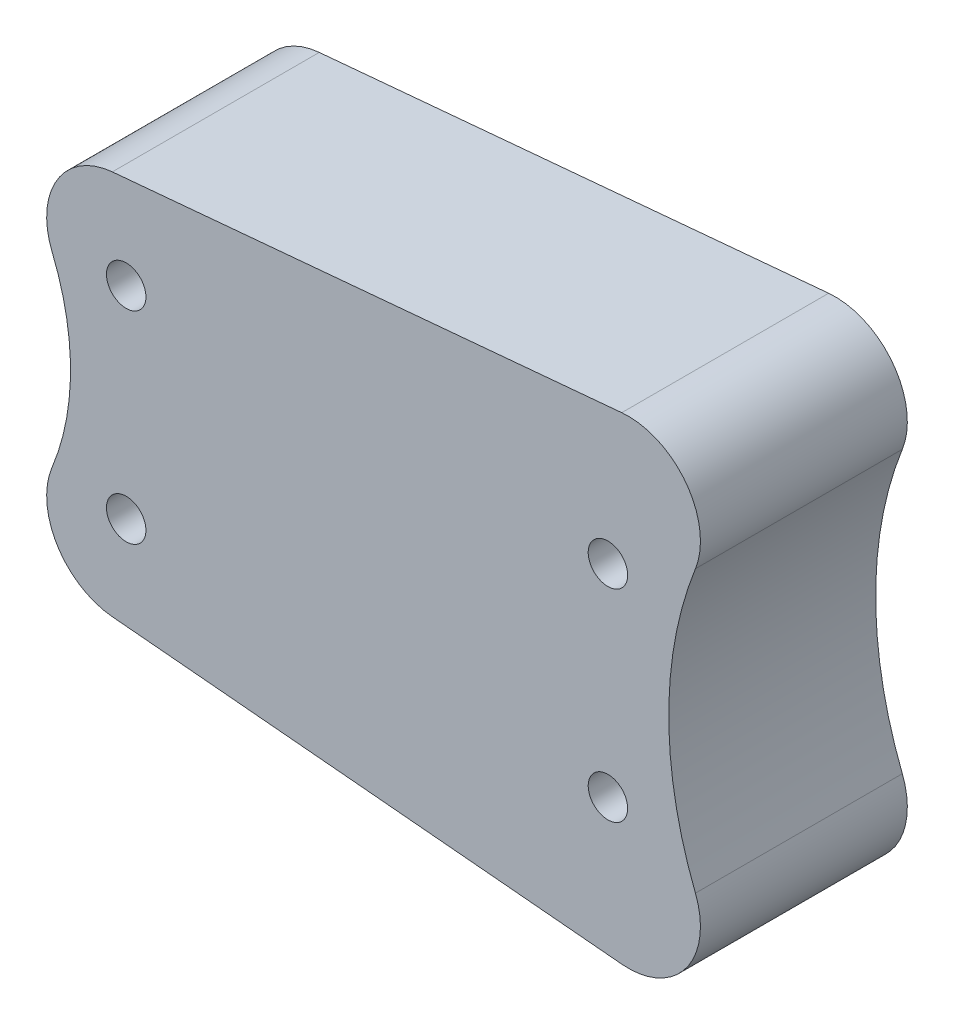
ISO-10303-21;
HEADER;
FILE_DESCRIPTION(('STEP AP214'),'2;1');
FILE_NAME('part.step','',(''),(''),'','','');
FILE_SCHEMA(('AUTOMOTIVE_DESIGN { 1 0 10303 214 1 1 1 1 }'));
ENDSEC;
DATA;
#1=APPLICATION_CONTEXT('core data for automotive mechanical design processes');
#2=APPLICATION_PROTOCOL_DEFINITION('international standard','automotive_design',2000,#1);
#3=PRODUCT_CONTEXT('',#1,'mechanical');
#4=PRODUCT('Part','Part','',(#3));
#5=PRODUCT_RELATED_PRODUCT_CATEGORY('part','',(#4));
#6=PRODUCT_DEFINITION_FORMATION('','',#4);
#7=PRODUCT_DEFINITION_CONTEXT('part definition',#1,'design');
#8=PRODUCT_DEFINITION('design','',#6,#7);
#9=PRODUCT_DEFINITION_SHAPE('','',#8);
#10=(LENGTH_UNIT() NAMED_UNIT(*) SI_UNIT(.MILLI.,.METRE.));
#11=(NAMED_UNIT(*) PLANE_ANGLE_UNIT() SI_UNIT($,.RADIAN.));
#12=(NAMED_UNIT(*) SI_UNIT($,.STERADIAN.) SOLID_ANGLE_UNIT());
#13=UNCERTAINTY_MEASURE_WITH_UNIT(LENGTH_MEASURE(1.E-05),#10,'distance_accuracy_value','');
#14=(GEOMETRIC_REPRESENTATION_CONTEXT(3) GLOBAL_UNCERTAINTY_ASSIGNED_CONTEXT((#13)) GLOBAL_UNIT_ASSIGNED_CONTEXT((#10,
#11,#12)) REPRESENTATION_CONTEXT('',''));
#15=CARTESIAN_POINT('',(0.,0.,0.));
#16=DIRECTION('',(0.,0.,1.));
#17=DIRECTION('',(1.,0.,0.));
#18=AXIS2_PLACEMENT_3D('',#15,#16,#17);
#19=CARTESIAN_POINT('',(-255.,0.,21.5));
#20=DIRECTION('',(0.,0.,1.));
#21=DIRECTION('',(1.,0.,0.));
#22=AXIS2_PLACEMENT_3D('',#19,#20,#21);
#23=PLANE('',#22);
#24=CARTESIAN_POINT('',(-92.3223164897252,-21.,21.5));
#25=DIRECTION('',(0.,0.,1.));
#26=DIRECTION('',(1.,0.,0.));
#27=AXIS2_PLACEMENT_3D('',#24,#25,#26);
#28=CIRCLE('',#27,4.1);
#29=CARTESIAN_POINT('',(-88.2223164897252,-21.,21.5));
#30=VERTEX_POINT('',#29);
#31=EDGE_CURVE('E190',#30,#30,#28,.T.);
#32=ORIENTED_EDGE('',*,*,#31,.F.);
#33=EDGE_LOOP('',(#32));
#34=FACE_BOUND('',#33,.T.);
#35=CARTESIAN_POINT('',(-192.444390405176,21.,21.5));
#36=DIRECTION('',(0.,0.,1.));
#37=DIRECTION('',(1.,0.,0.));
#38=AXIS2_PLACEMENT_3D('',#35,#36,#37);
#39=CIRCLE('',#38,4.09999999999999);
#40=CARTESIAN_POINT('',(-188.344390405176,21.,21.5));
#41=VERTEX_POINT('',#40);
#42=EDGE_CURVE('E133',#41,#41,#39,.T.);
#43=ORIENTED_EDGE('',*,*,#42,.F.);
#44=EDGE_LOOP('',(#43));
#45=FACE_BOUND('',#44,.T.);
#46=CARTESIAN_POINT('',(-255.,0.,21.5));
#47=DIRECTION('',(0.,0.,-1.));
#48=DIRECTION('',(1.,0.,0.));
#49=AXIS2_PLACEMENT_3D('',#46,#47,#48);
#50=CIRCLE('',#49,50.9863947475541);
#51=CARTESIAN_POINT('',(-207.84516111494,19.3915862960573,21.5));
#52=VERTEX_POINT('',#51);
#53=CARTESIAN_POINT('',(-207.84516111494,-19.3915862960573,21.5));
#54=VERTEX_POINT('',#53);
#55=EDGE_CURVE('E138',#52,#54,#50,.T.);
#56=ORIENTED_EDGE('',*,*,#55,.T.);
#57=CARTESIAN_POINT('',(-193.972390020258,-25.0965159323072,21.5));
#58=DIRECTION('',(0.,0.,1.));
#59=DIRECTION('',(1.,0.,0.));
#60=AXIS2_PLACEMENT_3D('',#57,#58,#59);
#61=CIRCLE('',#60,15.);
#62=CARTESIAN_POINT('',(-195.326131505696,-40.0353038346306,21.5));
#63=VERTEX_POINT('',#62);
#64=EDGE_CURVE('E152',#54,#63,#61,.T.);
#65=ORIENTED_EDGE('',*,*,#64,.T.);
#66=DIRECTION('',(0.995919193488227,-0.090249432362533,0.));
#67=VECTOR('',#66,1.);
#68=CARTESIAN_POINT('',(-220.71165321015,-37.7348873560312,21.5));
#69=LINE('',#68,#67);
#70=CARTESIAN_POINT('',(-89.449992689825,-49.6297182121682,21.5));
#71=VERTEX_POINT('',#70);
#72=EDGE_CURVE('E119',#63,#71,#69,.T.);
#73=ORIENTED_EDGE('',*,*,#72,.T.);
#74=CARTESIAN_POINT('',(-88.0962512043871,-34.6909303098448,21.5));
#75=DIRECTION('',(0.,0.,1.));
#76=DIRECTION('',(1.,0.,0.));
#77=AXIS2_PLACEMENT_3D('',#74,#75,#76);
#78=CIRCLE('',#77,15.);
#79=CARTESIAN_POINT('',(-74.1393877866708,-29.1949350824803,21.5));
#80=VERTEX_POINT('',#79);
#81=EDGE_CURVE('E148',#71,#80,#78,.T.);
#82=ORIENTED_EDGE('',*,*,#81,.T.);
#83=CARTESIAN_POINT('',(0.,0.,21.5));
#84=DIRECTION('',(0.,0.,-1.));
#85=DIRECTION('',(1.,0.,0.));
#86=AXIS2_PLACEMENT_3D('',#83,#84,#85);
#87=CIRCLE('',#86,79.6805688725463);
#88=CARTESIAN_POINT('',(-74.1393877866708,29.1949350824803,21.5));
#89=VERTEX_POINT('',#88);
#90=EDGE_CURVE('E161',#80,#89,#87,.T.);
#91=ORIENTED_EDGE('',*,*,#90,.T.);
#92=CARTESIAN_POINT('',(-88.0962512043871,34.6909303098448,21.5));
#93=DIRECTION('',(0.,0.,1.));
#94=DIRECTION('',(1.,0.,0.));
#95=AXIS2_PLACEMENT_3D('',#92,#93,#94);
#96=CIRCLE('',#95,15.);
#97=CARTESIAN_POINT('',(-89.449992689825,49.6297182121682,21.5));
#98=VERTEX_POINT('',#97);
#99=EDGE_CURVE('E54',#89,#98,#96,.T.);
#100=ORIENTED_EDGE('',*,*,#99,.T.);
#101=DIRECTION('',(-0.995919193488227,-0.090249432362533,0.));
#102=VECTOR('',#101,1.);
#103=CARTESIAN_POINT('',(-220.71165321015,37.7348873560312,21.5));
#104=LINE('',#103,#102);
#105=CARTESIAN_POINT('',(-195.326131505696,40.0353038346306,21.5));
#106=VERTEX_POINT('',#105);
#107=EDGE_CURVE('E139',#98,#106,#104,.T.);
#108=ORIENTED_EDGE('',*,*,#107,.T.);
#109=CARTESIAN_POINT('',(-193.972390020258,25.0965159323072,21.5));
#110=DIRECTION('',(0.,0.,1.));
#111=DIRECTION('',(1.,0.,0.));
#112=AXIS2_PLACEMENT_3D('',#109,#110,#111);
#113=CIRCLE('',#112,15.);
#114=EDGE_CURVE('E150',#106,#52,#113,.T.);
#115=ORIENTED_EDGE('',*,*,#114,.T.);
#116=EDGE_LOOP('',(#56,#65,#73,#82,#91,#100,#108,#115));
#117=FACE_BOUND('',#116,.T.);
#118=CARTESIAN_POINT('',(-192.444390405176,-21.,21.5));
#119=DIRECTION('',(0.,0.,1.));
#120=DIRECTION('',(1.,0.,0.));
#121=AXIS2_PLACEMENT_3D('',#118,#119,#120);
#122=CIRCLE('',#121,4.09999999999999);
#123=CARTESIAN_POINT('',(-188.344390405176,-21.,21.5));
#124=VERTEX_POINT('',#123);
#125=EDGE_CURVE('E184',#124,#124,#122,.T.);
#126=ORIENTED_EDGE('',*,*,#125,.F.);
#127=EDGE_LOOP('',(#126));
#128=FACE_BOUND('',#127,.T.);
#129=CARTESIAN_POINT('',(-92.3223164897252,21.,21.5));
#130=DIRECTION('',(0.,0.,1.));
#131=DIRECTION('',(1.,0.,0.));
#132=AXIS2_PLACEMENT_3D('',#129,#130,#131);
#133=CIRCLE('',#132,4.1);
#134=CARTESIAN_POINT('',(-88.2223164897252,21.,21.5));
#135=VERTEX_POINT('',#134);
#136=EDGE_CURVE('E196',#135,#135,#133,.T.);
#137=ORIENTED_EDGE('',*,*,#136,.F.);
#138=EDGE_LOOP('',(#137));
#139=FACE_BOUND('',#138,.T.);
#140=ADVANCED_FACE('F32',(#34,#45,#117,#128,#139),#23,.T.);
#141=CARTESIAN_POINT('',(-255.,0.,-21.5));
#142=DIRECTION('',(0.,0.,1.));
#143=DIRECTION('',(1.,0.,0.));
#144=AXIS2_PLACEMENT_3D('',#141,#142,#143);
#145=PLANE('',#144);
#146=DIRECTION('',(0.995919193488227,-0.090249432362533,0.));
#147=VECTOR('',#146,1.);
#148=CARTESIAN_POINT('',(-220.71165321015,-37.7348873560312,-21.5));
#149=LINE('',#148,#147);
#150=CARTESIAN_POINT('',(-195.326131505696,-40.0353038346306,-21.5));
#151=VERTEX_POINT('',#150);
#152=CARTESIAN_POINT('',(-89.449992689825,-49.6297182121682,-21.5));
#153=VERTEX_POINT('',#152);
#154=EDGE_CURVE('E116',#151,#153,#149,.T.);
#155=ORIENTED_EDGE('',*,*,#154,.F.);
#156=CARTESIAN_POINT('',(-193.972390020258,-25.0965159323072,-21.5));
#157=DIRECTION('',(0.,0.,1.));
#158=DIRECTION('',(1.,0.,0.));
#159=AXIS2_PLACEMENT_3D('',#156,#157,#158);
#160=CIRCLE('',#159,15.);
#161=CARTESIAN_POINT('',(-207.84516111494,-19.3915862960573,-21.5));
#162=VERTEX_POINT('',#161);
#163=EDGE_CURVE('E99',#151,#162,#160,.F.);
#164=ORIENTED_EDGE('',*,*,#163,.T.);
#165=CARTESIAN_POINT('',(-255.,0.,-21.5));
#166=DIRECTION('',(0.,0.,-1.));
#167=DIRECTION('',(1.,0.,0.));
#168=AXIS2_PLACEMENT_3D('',#165,#166,#167);
#169=CIRCLE('',#168,50.9863947475541);
#170=CARTESIAN_POINT('',(-207.84516111494,19.3915862960573,-21.5));
#171=VERTEX_POINT('',#170);
#172=EDGE_CURVE('E128',#171,#162,#169,.T.);
#173=ORIENTED_EDGE('',*,*,#172,.F.);
#174=CARTESIAN_POINT('',(-193.972390020258,25.0965159323072,-21.5));
#175=DIRECTION('',(0.,0.,1.));
#176=DIRECTION('',(1.,0.,0.));
#177=AXIS2_PLACEMENT_3D('',#174,#175,#176);
#178=CIRCLE('',#177,15.);
#179=CARTESIAN_POINT('',(-195.326131505696,40.0353038346306,-21.5));
#180=VERTEX_POINT('',#179);
#181=EDGE_CURVE('E110',#171,#180,#178,.F.);
#182=ORIENTED_EDGE('',*,*,#181,.T.);
#183=DIRECTION('',(-0.995919193488227,-0.090249432362533,0.));
#184=VECTOR('',#183,1.);
#185=CARTESIAN_POINT('',(-220.71165321015,37.7348873560312,-21.5));
#186=LINE('',#185,#184);
#187=CARTESIAN_POINT('',(-89.449992689825,49.6297182121682,-21.5));
#188=VERTEX_POINT('',#187);
#189=EDGE_CURVE('E131',#188,#180,#186,.T.);
#190=ORIENTED_EDGE('',*,*,#189,.F.);
#191=CARTESIAN_POINT('',(-88.0962512043871,34.6909303098448,-21.5));
#192=DIRECTION('',(0.,0.,1.));
#193=DIRECTION('',(1.,0.,0.));
#194=AXIS2_PLACEMENT_3D('',#191,#192,#193);
#195=CIRCLE('',#194,15.);
#196=CARTESIAN_POINT('',(-74.1393877866708,29.1949350824803,-21.5));
#197=VERTEX_POINT('',#196);
#198=EDGE_CURVE('E120',#188,#197,#195,.F.);
#199=ORIENTED_EDGE('',*,*,#198,.T.);
#200=CARTESIAN_POINT('',(0.,0.,-21.5));
#201=DIRECTION('',(0.,0.,-1.));
#202=DIRECTION('',(1.,0.,0.));
#203=AXIS2_PLACEMENT_3D('',#200,#201,#202);
#204=CIRCLE('',#203,79.6805688725463);
#205=CARTESIAN_POINT('',(-74.1393877866708,-29.1949350824803,-21.5));
#206=VERTEX_POINT('',#205);
#207=EDGE_CURVE('E127',#206,#197,#204,.T.);
#208=ORIENTED_EDGE('',*,*,#207,.F.);
#209=CARTESIAN_POINT('',(-88.0962512043871,-34.6909303098448,-21.5));
#210=DIRECTION('',(0.,0.,1.));
#211=DIRECTION('',(1.,0.,0.));
#212=AXIS2_PLACEMENT_3D('',#209,#210,#211);
#213=CIRCLE('',#212,15.);
#214=EDGE_CURVE('E126',#206,#153,#213,.F.);
#215=ORIENTED_EDGE('',*,*,#214,.T.);
#216=EDGE_LOOP('',(#155,#164,#173,#182,#190,#199,#208,#215));
#217=FACE_BOUND('',#216,.T.);
#218=CARTESIAN_POINT('',(-192.444390405176,21.,-21.5));
#219=DIRECTION('',(0.,0.,1.));
#220=DIRECTION('',(1.,0.,0.));
#221=AXIS2_PLACEMENT_3D('',#218,#219,#220);
#222=CIRCLE('',#221,4.09999999999999);
#223=CARTESIAN_POINT('',(-188.344390405176,21.,-21.5));
#224=VERTEX_POINT('',#223);
#225=EDGE_CURVE('E181',#224,#224,#222,.T.);
#226=ORIENTED_EDGE('',*,*,#225,.T.);
#227=EDGE_LOOP('',(#226));
#228=FACE_BOUND('',#227,.T.);
#229=CARTESIAN_POINT('',(-192.444390405176,-21.,-21.5));
#230=DIRECTION('',(0.,0.,1.));
#231=DIRECTION('',(1.,0.,0.));
#232=AXIS2_PLACEMENT_3D('',#229,#230,#231);
#233=CIRCLE('',#232,4.09999999999999);
#234=CARTESIAN_POINT('',(-188.344390405176,-21.,-21.5));
#235=VERTEX_POINT('',#234);
#236=EDGE_CURVE('E187',#235,#235,#233,.T.);
#237=ORIENTED_EDGE('',*,*,#236,.T.);
#238=EDGE_LOOP('',(#237));
#239=FACE_BOUND('',#238,.T.);
#240=CARTESIAN_POINT('',(-92.3223164897252,-21.,-21.5));
#241=DIRECTION('',(0.,0.,1.));
#242=DIRECTION('',(1.,0.,0.));
#243=AXIS2_PLACEMENT_3D('',#240,#241,#242);
#244=CIRCLE('',#243,4.1);
#245=CARTESIAN_POINT('',(-88.2223164897252,-21.,-21.5));
#246=VERTEX_POINT('',#245);
#247=EDGE_CURVE('E193',#246,#246,#244,.T.);
#248=ORIENTED_EDGE('',*,*,#247,.T.);
#249=EDGE_LOOP('',(#248));
#250=FACE_BOUND('',#249,.T.);
#251=CARTESIAN_POINT('',(-92.3223164897252,21.,-21.5));
#252=DIRECTION('',(0.,0.,1.));
#253=DIRECTION('',(1.,0.,0.));
#254=AXIS2_PLACEMENT_3D('',#251,#252,#253);
#255=CIRCLE('',#254,4.1);
#256=CARTESIAN_POINT('',(-88.2223164897252,21.,-21.5));
#257=VERTEX_POINT('',#256);
#258=EDGE_CURVE('E199',#257,#257,#255,.T.);
#259=ORIENTED_EDGE('',*,*,#258,.T.);
#260=EDGE_LOOP('',(#259));
#261=FACE_BOUND('',#260,.T.);
#262=ADVANCED_FACE('F123',(#217,#228,#239,#250,#261),#145,.F.);
#263=CARTESIAN_POINT('',(-255.,0.,21.5));
#264=DIRECTION('',(0.,0.,-1.));
#265=DIRECTION('',(-1.,0.,0.));
#266=AXIS2_PLACEMENT_3D('',#263,#264,#265);
#267=CYLINDRICAL_SURFACE('',#266,50.9863947475541);
#268=ORIENTED_EDGE('',*,*,#172,.T.);
#269=DIRECTION('',(0.,0.,-1.));
#270=VECTOR('',#269,1.);
#271=CARTESIAN_POINT('',(-207.84516111494,-19.3915862960573,21.5));
#272=LINE('',#271,#270);
#273=EDGE_CURVE('E104',#162,#54,#272,.F.);
#274=ORIENTED_EDGE('',*,*,#273,.T.);
#275=ORIENTED_EDGE('',*,*,#55,.F.);
#276=DIRECTION('',(0.,0.,-1.));
#277=VECTOR('',#276,1.);
#278=CARTESIAN_POINT('',(-207.84516111494,19.3915862960573,21.5));
#279=LINE('',#278,#277);
#280=EDGE_CURVE('E109',#52,#171,#279,.T.);
#281=ORIENTED_EDGE('',*,*,#280,.T.);
#282=EDGE_LOOP('',(#268,#274,#275,#281));
#283=FACE_BOUND('',#282,.T.);
#284=ADVANCED_FACE('F177',(#283),#267,.F.);
#285=CARTESIAN_POINT('',(-220.71165321015,-37.7348873560312,21.5));
#286=DIRECTION('',(0.090249432362533,0.995919193488227,0.));
#287=DIRECTION('',(-0.995919193488227,0.090249432362533,0.));
#288=AXIS2_PLACEMENT_3D('',#285,#286,#287);
#289=PLANE('',#288);
#290=ORIENTED_EDGE('',*,*,#72,.F.);
#291=DIRECTION('',(0.,0.,-1.));
#292=VECTOR('',#291,1.);
#293=CARTESIAN_POINT('',(-195.326131505696,-40.0353038346306,21.5));
#294=LINE('',#293,#292);
#295=EDGE_CURVE('E103',#63,#151,#294,.T.);
#296=ORIENTED_EDGE('',*,*,#295,.T.);
#297=ORIENTED_EDGE('',*,*,#154,.T.);
#298=DIRECTION('',(0.,0.,-1.));
#299=VECTOR('',#298,1.);
#300=CARTESIAN_POINT('',(-89.4499926898251,-49.6297182121682,21.5));
#301=LINE('',#300,#299);
#302=EDGE_CURVE('E121',#153,#71,#301,.F.);
#303=ORIENTED_EDGE('',*,*,#302,.T.);
#304=EDGE_LOOP('',(#290,#296,#297,#303));
#305=FACE_BOUND('',#304,.T.);
#306=ADVANCED_FACE('F115',(#305),#289,.F.);
#307=CARTESIAN_POINT('',(0.,0.,21.5));
#308=DIRECTION('',(0.,0.,-1.));
#309=DIRECTION('',(-1.,0.,0.));
#310=AXIS2_PLACEMENT_3D('',#307,#308,#309);
#311=CYLINDRICAL_SURFACE('',#310,79.6805688725463);
#312=ORIENTED_EDGE('',*,*,#90,.F.);
#313=DIRECTION('',(0.,0.,-1.));
#314=VECTOR('',#313,1.);
#315=CARTESIAN_POINT('',(-74.1393877866708,-29.1949350824803,21.5));
#316=LINE('',#315,#314);
#317=EDGE_CURVE('E11',#80,#206,#316,.T.);
#318=ORIENTED_EDGE('',*,*,#317,.T.);
#319=ORIENTED_EDGE('',*,*,#207,.T.);
#320=DIRECTION('',(0.,0.,-1.));
#321=VECTOR('',#320,1.);
#322=CARTESIAN_POINT('',(-74.1393877866708,29.1949350824803,21.5));
#323=LINE('',#322,#321);
#324=EDGE_CURVE('E40',#197,#89,#323,.F.);
#325=ORIENTED_EDGE('',*,*,#324,.T.);
#326=EDGE_LOOP('',(#312,#318,#319,#325));
#327=FACE_BOUND('',#326,.T.);
#328=ADVANCED_FACE('F160',(#327),#311,.F.);
#329=CARTESIAN_POINT('',(-220.71165321015,37.7348873560312,21.5));
#330=DIRECTION('',(0.090249432362533,-0.995919193488227,0.));
#331=DIRECTION('',(0.995919193488227,0.090249432362533,0.));
#332=AXIS2_PLACEMENT_3D('',#329,#330,#331);
#333=PLANE('',#332);
#334=ORIENTED_EDGE('',*,*,#189,.T.);
#335=DIRECTION('',(0.,0.,-1.));
#336=VECTOR('',#335,1.);
#337=CARTESIAN_POINT('',(-195.326131505696,40.0353038346306,21.5));
#338=LINE('',#337,#336);
#339=EDGE_CURVE('E47',#180,#106,#338,.F.);
#340=ORIENTED_EDGE('',*,*,#339,.T.);
#341=ORIENTED_EDGE('',*,*,#107,.F.);
#342=DIRECTION('',(0.,0.,-1.));
#343=VECTOR('',#342,1.);
#344=CARTESIAN_POINT('',(-89.4499926898251,49.6297182121682,21.5));
#345=LINE('',#344,#343);
#346=EDGE_CURVE('E154',#98,#188,#345,.T.);
#347=ORIENTED_EDGE('',*,*,#346,.T.);
#348=EDGE_LOOP('',(#334,#340,#341,#347));
#349=FACE_BOUND('',#348,.T.);
#350=ADVANCED_FACE('F170',(#349),#333,.F.);
#351=CARTESIAN_POINT('',(-192.444390405176,21.,21.5));
#352=DIRECTION('',(0.,0.,-1.));
#353=DIRECTION('',(-1.,0.,0.));
#354=AXIS2_PLACEMENT_3D('',#351,#352,#353);
#355=CYLINDRICAL_SURFACE('',#354,4.09999999999999);
#356=ORIENTED_EDGE('',*,*,#42,.T.);
#357=EDGE_LOOP('',(#356));
#358=FACE_BOUND('',#357,.T.);
#359=ORIENTED_EDGE('',*,*,#225,.F.);
#360=EDGE_LOOP('',(#359));
#361=FACE_BOUND('',#360,.T.);
#362=ADVANCED_FACE('F218',(#358,#361),#355,.F.);
#363=CARTESIAN_POINT('',(-192.444390405176,-21.,21.5));
#364=DIRECTION('',(0.,0.,-1.));
#365=DIRECTION('',(-1.,0.,0.));
#366=AXIS2_PLACEMENT_3D('',#363,#364,#365);
#367=CYLINDRICAL_SURFACE('',#366,4.09999999999999);
#368=ORIENTED_EDGE('',*,*,#125,.T.);
#369=EDGE_LOOP('',(#368));
#370=FACE_BOUND('',#369,.T.);
#371=ORIENTED_EDGE('',*,*,#236,.F.);
#372=EDGE_LOOP('',(#371));
#373=FACE_BOUND('',#372,.T.);
#374=ADVANCED_FACE('F310',(#370,#373),#367,.F.);
#375=CARTESIAN_POINT('',(-92.3223164897252,-21.,21.5));
#376=DIRECTION('',(0.,0.,-1.));
#377=DIRECTION('',(-1.,0.,0.));
#378=AXIS2_PLACEMENT_3D('',#375,#376,#377);
#379=CYLINDRICAL_SURFACE('',#378,4.1);
#380=ORIENTED_EDGE('',*,*,#31,.T.);
#381=EDGE_LOOP('',(#380));
#382=FACE_BOUND('',#381,.T.);
#383=ORIENTED_EDGE('',*,*,#247,.F.);
#384=EDGE_LOOP('',(#383));
#385=FACE_BOUND('',#384,.T.);
#386=ADVANCED_FACE('F301',(#382,#385),#379,.F.);
#387=CARTESIAN_POINT('',(-92.3223164897252,21.,21.5));
#388=DIRECTION('',(0.,0.,-1.));
#389=DIRECTION('',(-1.,0.,0.));
#390=AXIS2_PLACEMENT_3D('',#387,#388,#389);
#391=CYLINDRICAL_SURFACE('',#390,4.1);
#392=ORIENTED_EDGE('',*,*,#136,.T.);
#393=EDGE_LOOP('',(#392));
#394=FACE_BOUND('',#393,.T.);
#395=ORIENTED_EDGE('',*,*,#258,.F.);
#396=EDGE_LOOP('',(#395));
#397=FACE_BOUND('',#396,.T.);
#398=ADVANCED_FACE('F205',(#394,#397),#391,.F.);
#399=CARTESIAN_POINT('',(-193.972390020258,-25.0965159323072,21.5));
#400=DIRECTION('',(0.,0.,-1.));
#401=DIRECTION('',(-1.,0.,0.));
#402=AXIS2_PLACEMENT_3D('',#399,#400,#401);
#403=CYLINDRICAL_SURFACE('',#402,15.);
#404=ORIENTED_EDGE('',*,*,#64,.F.);
#405=ORIENTED_EDGE('',*,*,#273,.F.);
#406=ORIENTED_EDGE('',*,*,#163,.F.);
#407=ORIENTED_EDGE('',*,*,#295,.F.);
#408=EDGE_LOOP('',(#404,#405,#406,#407));
#409=FACE_BOUND('',#408,.T.);
#410=ADVANCED_FACE('F102',(#409),#403,.T.);
#411=CARTESIAN_POINT('',(-193.972390020258,25.0965159323072,21.5));
#412=DIRECTION('',(0.,0.,-1.));
#413=DIRECTION('',(-1.,0.,0.));
#414=AXIS2_PLACEMENT_3D('',#411,#412,#413);
#415=CYLINDRICAL_SURFACE('',#414,15.);
#416=ORIENTED_EDGE('',*,*,#114,.F.);
#417=ORIENTED_EDGE('',*,*,#339,.F.);
#418=ORIENTED_EDGE('',*,*,#181,.F.);
#419=ORIENTED_EDGE('',*,*,#280,.F.);
#420=EDGE_LOOP('',(#416,#417,#418,#419));
#421=FACE_BOUND('',#420,.T.);
#422=ADVANCED_FACE('F174',(#421),#415,.T.);
#423=CARTESIAN_POINT('',(-88.0962512043871,-34.6909303098448,21.5));
#424=DIRECTION('',(0.,0.,-1.));
#425=DIRECTION('',(-1.,0.,0.));
#426=AXIS2_PLACEMENT_3D('',#423,#424,#425);
#427=CYLINDRICAL_SURFACE('',#426,15.);
#428=ORIENTED_EDGE('',*,*,#81,.F.);
#429=ORIENTED_EDGE('',*,*,#302,.F.);
#430=ORIENTED_EDGE('',*,*,#214,.F.);
#431=ORIENTED_EDGE('',*,*,#317,.F.);
#432=EDGE_LOOP('',(#428,#429,#430,#431));
#433=FACE_BOUND('',#432,.T.);
#434=ADVANCED_FACE('F232',(#433),#427,.T.);
#435=CARTESIAN_POINT('',(-88.0962512043871,34.6909303098448,21.5));
#436=DIRECTION('',(0.,0.,-1.));
#437=DIRECTION('',(-1.,0.,0.));
#438=AXIS2_PLACEMENT_3D('',#435,#436,#437);
#439=CYLINDRICAL_SURFACE('',#438,15.);
#440=ORIENTED_EDGE('',*,*,#99,.F.);
#441=ORIENTED_EDGE('',*,*,#324,.F.);
#442=ORIENTED_EDGE('',*,*,#198,.F.);
#443=ORIENTED_EDGE('',*,*,#346,.F.);
#444=EDGE_LOOP('',(#440,#441,#442,#443));
#445=FACE_BOUND('',#444,.T.);
#446=ADVANCED_FACE('F34',(#445),#439,.T.);
#447=CLOSED_SHELL('',(#140,#262,#284,#306,#328,#350,#362,#374,#386,#398,#410,#422,#434,#446));
#448=MANIFOLD_SOLID_BREP('B2',#447);
#449=ADVANCED_BREP_SHAPE_REPRESENTATION('',(#18,#448),#14);
#450=SHAPE_DEFINITION_REPRESENTATION(#9,#449);
ENDSEC;
END-ISO-10303-21;
